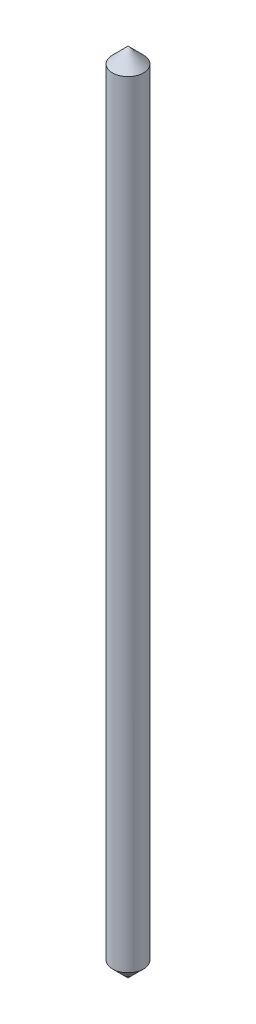
ISO-10303-21;
HEADER;
FILE_DESCRIPTION(('STEP AP214'),'2;1');
FILE_NAME('part.step','',(''),(''),'','','');
FILE_SCHEMA(('AUTOMOTIVE_DESIGN { 1 0 10303 214 1 1 1 1 }'));
ENDSEC;
DATA;
#1=APPLICATION_CONTEXT('core data for automotive mechanical design processes');
#2=APPLICATION_PROTOCOL_DEFINITION('international standard','automotive_design',2000,#1);
#3=PRODUCT_CONTEXT('',#1,'mechanical');
#4=PRODUCT('Part','Part','',(#3));
#5=PRODUCT_RELATED_PRODUCT_CATEGORY('part','',(#4));
#6=PRODUCT_DEFINITION_FORMATION('','',#4);
#7=PRODUCT_DEFINITION_CONTEXT('part definition',#1,'design');
#8=PRODUCT_DEFINITION('design','',#6,#7);
#9=PRODUCT_DEFINITION_SHAPE('','',#8);
#10=(LENGTH_UNIT() NAMED_UNIT(*) SI_UNIT(.MILLI.,.METRE.));
#11=(NAMED_UNIT(*) PLANE_ANGLE_UNIT() SI_UNIT($,.RADIAN.));
#12=(NAMED_UNIT(*) SI_UNIT($,.STERADIAN.) SOLID_ANGLE_UNIT());
#13=UNCERTAINTY_MEASURE_WITH_UNIT(LENGTH_MEASURE(1.E-05),#10,'distance_accuracy_value','');
#14=(GEOMETRIC_REPRESENTATION_CONTEXT(3) GLOBAL_UNCERTAINTY_ASSIGNED_CONTEXT((#13)) GLOBAL_UNIT_ASSIGNED_CONTEXT((#10,
#11,#12)) REPRESENTATION_CONTEXT('',''));
#15=CARTESIAN_POINT('',(0.,0.,0.));
#16=DIRECTION('',(0.,0.,1.));
#17=DIRECTION('',(1.,0.,0.));
#18=AXIS2_PLACEMENT_3D('',#15,#16,#17);
#19=CARTESIAN_POINT('',(0.,250.,0.));
#20=DIRECTION('',(0.,-1.,0.));
#21=DIRECTION('',(0.,0.,-1.));
#22=AXIS2_PLACEMENT_3D('',#19,#20,#21);
#23=CYLINDRICAL_SURFACE('',#22,5.);
#24=CARTESIAN_POINT('',(0.,250.,0.));
#25=DIRECTION('',(0.,1.,0.));
#26=DIRECTION('',(0.,0.,1.));
#27=AXIS2_PLACEMENT_3D('',#24,#25,#26);
#28=CIRCLE('',#27,5.);
#29=CARTESIAN_POINT('',(0.,250.,5.));
#30=VERTEX_POINT('',#29);
#31=EDGE_CURVE('E11',#30,#30,#28,.T.);
#32=ORIENTED_EDGE('',*,*,#31,.F.);
#33=EDGE_LOOP('',(#32));
#34=FACE_BOUND('',#33,.T.);
#35=CARTESIAN_POINT('',(0.,0.,0.));
#36=DIRECTION('',(0.,-1.,0.));
#37=DIRECTION('',(0.,0.,-1.));
#38=AXIS2_PLACEMENT_3D('',#35,#36,#37);
#39=CIRCLE('',#38,5.);
#40=CARTESIAN_POINT('',(0.,0.,-5.));
#41=VERTEX_POINT('',#40);
#42=EDGE_CURVE('E40',#41,#41,#39,.T.);
#43=ORIENTED_EDGE('',*,*,#42,.F.);
#44=EDGE_LOOP('',(#43));
#45=FACE_BOUND('',#44,.T.);
#46=ADVANCED_FACE('F33',(#34,#45),#23,.T.);
#47=CARTESIAN_POINT('',(0.,250.,0.));
#48=DIRECTION('',(0.,-1.,0.));
#49=DIRECTION('',(0.,0.,1.));
#50=AXIS2_PLACEMENT_3D('',#47,#48,#49);
#51=CONICAL_SURFACE('',#50,5.,0.78539816339745);
#52=CARTESIAN_POINT('',(0.,255.,0.));
#53=VERTEX_POINT('',#52);
#54=VERTEX_LOOP('',#53);
#55=FACE_BOUND('',#54,.T.);
#56=ORIENTED_EDGE('',*,*,#31,.T.);
#57=EDGE_LOOP('',(#56));
#58=FACE_BOUND('',#57,.T.);
#59=ADVANCED_FACE('F49',(#55,#58),#51,.T.);
#60=CARTESIAN_POINT('',(0.,0.,0.));
#61=DIRECTION('',(0.,1.,0.));
#62=DIRECTION('',(0.,0.,-1.));
#63=AXIS2_PLACEMENT_3D('',#60,#61,#62);
#64=CONICAL_SURFACE('',#63,5.,0.78539816339745);
#65=CARTESIAN_POINT('',(0.,-4.99999999999998,0.));
#66=VERTEX_POINT('',#65);
#67=VERTEX_LOOP('',#66);
#68=FACE_BOUND('',#67,.T.);
#69=ORIENTED_EDGE('',*,*,#42,.T.);
#70=EDGE_LOOP('',(#69));
#71=FACE_BOUND('',#70,.T.);
#72=ADVANCED_FACE('F46',(#68,#71),#64,.T.);
#73=CLOSED_SHELL('',(#46,#59,#72));
#74=MANIFOLD_SOLID_BREP('B2',#73);
#75=ADVANCED_BREP_SHAPE_REPRESENTATION('',(#18,#74),#14);
#76=SHAPE_DEFINITION_REPRESENTATION(#9,#75);
ENDSEC;
END-ISO-10303-21;
